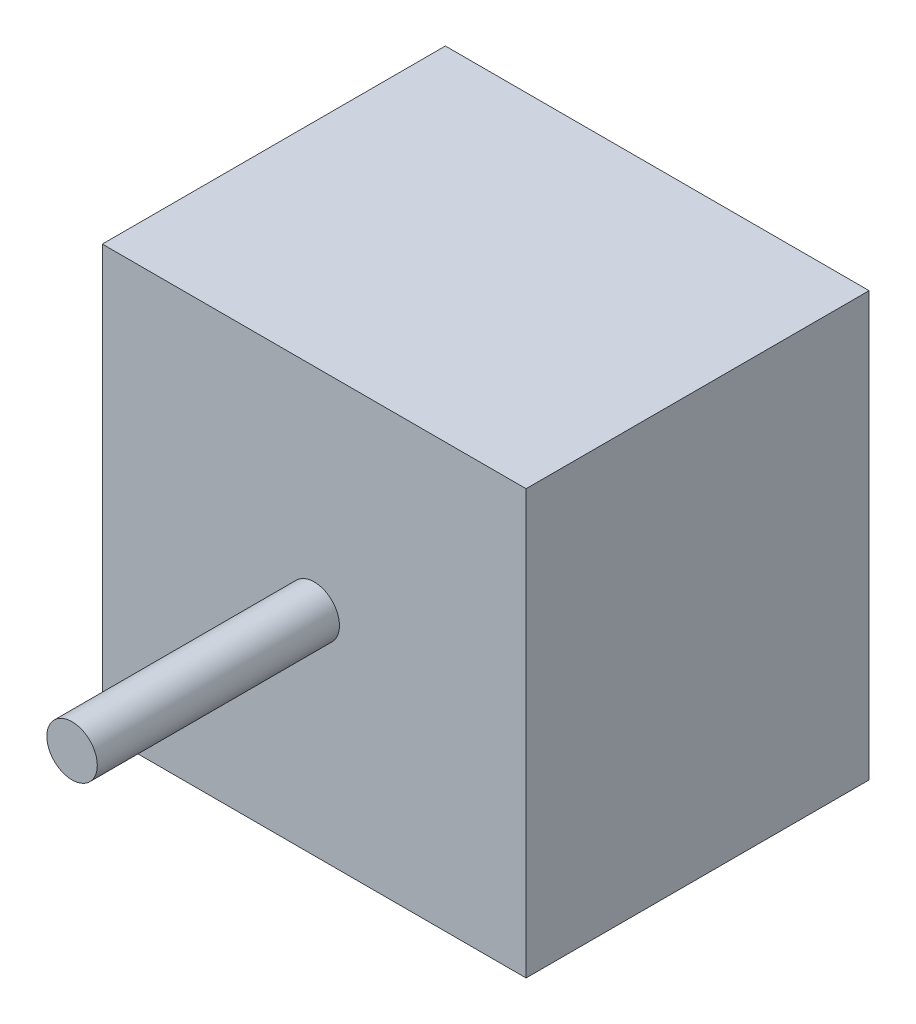
ISO-10303-21;
HEADER;
FILE_DESCRIPTION(('STEP AP214'),'2;1');
FILE_NAME('part.step','',(''),(''),'','','');
FILE_SCHEMA(('AUTOMOTIVE_DESIGN { 1 0 10303 214 1 1 1 1 }'));
ENDSEC;
DATA;
#1=APPLICATION_CONTEXT('core data for automotive mechanical design processes');
#2=APPLICATION_PROTOCOL_DEFINITION('international standard','automotive_design',2000,#1);
#3=PRODUCT_CONTEXT('',#1,'mechanical');
#4=PRODUCT('Part','Part','',(#3));
#5=PRODUCT_RELATED_PRODUCT_CATEGORY('part','',(#4));
#6=PRODUCT_DEFINITION_FORMATION('','',#4);
#7=PRODUCT_DEFINITION_CONTEXT('part definition',#1,'design');
#8=PRODUCT_DEFINITION('design','',#6,#7);
#9=PRODUCT_DEFINITION_SHAPE('','',#8);
#10=(LENGTH_UNIT() NAMED_UNIT(*) SI_UNIT(.MILLI.,.METRE.));
#11=(NAMED_UNIT(*) PLANE_ANGLE_UNIT() SI_UNIT($,.RADIAN.));
#12=(NAMED_UNIT(*) SI_UNIT($,.STERADIAN.) SOLID_ANGLE_UNIT());
#13=UNCERTAINTY_MEASURE_WITH_UNIT(LENGTH_MEASURE(1.E-05),#10,'distance_accuracy_value','');
#14=(GEOMETRIC_REPRESENTATION_CONTEXT(3) GLOBAL_UNCERTAINTY_ASSIGNED_CONTEXT((#13)) GLOBAL_UNIT_ASSIGNED_CONTEXT((#10,
#11,#12)) REPRESENTATION_CONTEXT('',''));
#15=CARTESIAN_POINT('',(0.,0.,0.));
#16=DIRECTION('',(0.,0.,1.));
#17=DIRECTION('',(1.,0.,0.));
#18=AXIS2_PLACEMENT_3D('',#15,#16,#17);
#19=CARTESIAN_POINT('',(21.,21.,34.));
#20=DIRECTION('',(-1.,0.,0.));
#21=DIRECTION('',(0.,0.,1.));
#22=AXIS2_PLACEMENT_3D('',#19,#20,#21);
#23=PLANE('',#22);
#24=DIRECTION('',(0.,1.,0.));
#25=VECTOR('',#24,1.);
#26=CARTESIAN_POINT('',(21.,21.,0.));
#27=LINE('',#26,#25);
#28=CARTESIAN_POINT('',(21.,-21.,0.));
#29=VERTEX_POINT('',#28);
#30=CARTESIAN_POINT('',(21.,21.,0.));
#31=VERTEX_POINT('',#30);
#32=EDGE_CURVE('E98',#29,#31,#27,.T.);
#33=ORIENTED_EDGE('',*,*,#32,.T.);
#34=DIRECTION('',(0.,0.,-1.));
#35=VECTOR('',#34,1.);
#36=CARTESIAN_POINT('',(21.,21.,34.));
#37=LINE('',#36,#35);
#38=CARTESIAN_POINT('',(21.,21.,34.));
#39=VERTEX_POINT('',#38);
#40=EDGE_CURVE('E11',#39,#31,#37,.T.);
#41=ORIENTED_EDGE('',*,*,#40,.F.);
#42=DIRECTION('',(0.,1.,0.));
#43=VECTOR('',#42,1.);
#44=CARTESIAN_POINT('',(21.,21.,34.));
#45=LINE('',#44,#43);
#46=CARTESIAN_POINT('',(21.,-21.,34.));
#47=VERTEX_POINT('',#46);
#48=EDGE_CURVE('E86',#47,#39,#45,.T.);
#49=ORIENTED_EDGE('',*,*,#48,.F.);
#50=DIRECTION('',(0.,0.,-1.));
#51=VECTOR('',#50,1.);
#52=CARTESIAN_POINT('',(21.,-21.,34.));
#53=LINE('',#52,#51);
#54=EDGE_CURVE('E94',#47,#29,#53,.T.);
#55=ORIENTED_EDGE('',*,*,#54,.T.);
#56=EDGE_LOOP('',(#33,#41,#49,#55));
#57=FACE_BOUND('',#56,.T.);
#58=ADVANCED_FACE('F35',(#57),#23,.F.);
#59=CARTESIAN_POINT('',(-21.,21.,34.));
#60=DIRECTION('',(0.,-1.,0.));
#61=DIRECTION('',(0.,0.,-1.));
#62=AXIS2_PLACEMENT_3D('',#59,#60,#61);
#63=PLANE('',#62);
#64=DIRECTION('',(-1.,0.,0.));
#65=VECTOR('',#64,1.);
#66=CARTESIAN_POINT('',(-21.,21.,0.));
#67=LINE('',#66,#65);
#68=CARTESIAN_POINT('',(-21.,21.,0.));
#69=VERTEX_POINT('',#68);
#70=EDGE_CURVE('E90',#31,#69,#67,.T.);
#71=ORIENTED_EDGE('',*,*,#70,.T.);
#72=DIRECTION('',(0.,0.,-1.));
#73=VECTOR('',#72,1.);
#74=CARTESIAN_POINT('',(-21.,21.,34.));
#75=LINE('',#74,#73);
#76=CARTESIAN_POINT('',(-21.,21.,34.));
#77=VERTEX_POINT('',#76);
#78=EDGE_CURVE('E43',#77,#69,#75,.T.);
#79=ORIENTED_EDGE('',*,*,#78,.F.);
#80=DIRECTION('',(-1.,0.,0.));
#81=VECTOR('',#80,1.);
#82=CARTESIAN_POINT('',(-21.,21.,34.));
#83=LINE('',#82,#81);
#84=EDGE_CURVE('E81',#39,#77,#83,.T.);
#85=ORIENTED_EDGE('',*,*,#84,.F.);
#86=ORIENTED_EDGE('',*,*,#40,.T.);
#87=EDGE_LOOP('',(#71,#79,#85,#86));
#88=FACE_BOUND('',#87,.T.);
#89=ADVANCED_FACE('F89',(#88),#63,.F.);
#90=CARTESIAN_POINT('',(-21.,21.,34.));
#91=DIRECTION('',(1.,0.,0.));
#92=DIRECTION('',(0.,1.,0.));
#93=AXIS2_PLACEMENT_3D('',#90,#91,#92);
#94=PLANE('',#93);
#95=DIRECTION('',(0.,-1.,0.));
#96=VECTOR('',#95,1.);
#97=CARTESIAN_POINT('',(-21.,21.,0.));
#98=LINE('',#97,#96);
#99=CARTESIAN_POINT('',(-21.,-21.,0.));
#100=VERTEX_POINT('',#99);
#101=EDGE_CURVE('E68',#69,#100,#98,.T.);
#102=ORIENTED_EDGE('',*,*,#101,.T.);
#103=DIRECTION('',(0.,0.,-1.));
#104=VECTOR('',#103,1.);
#105=CARTESIAN_POINT('',(-21.,-21.,34.));
#106=LINE('',#105,#104);
#107=CARTESIAN_POINT('',(-21.,-21.,34.));
#108=VERTEX_POINT('',#107);
#109=EDGE_CURVE('E91',#108,#100,#106,.T.);
#110=ORIENTED_EDGE('',*,*,#109,.F.);
#111=DIRECTION('',(0.,-1.,0.));
#112=VECTOR('',#111,1.);
#113=CARTESIAN_POINT('',(-21.,21.,34.));
#114=LINE('',#113,#112);
#115=EDGE_CURVE('E84',#77,#108,#114,.T.);
#116=ORIENTED_EDGE('',*,*,#115,.F.);
#117=ORIENTED_EDGE('',*,*,#78,.T.);
#118=EDGE_LOOP('',(#102,#110,#116,#117));
#119=FACE_BOUND('',#118,.T.);
#120=ADVANCED_FACE('F92',(#119),#94,.F.);
#121=CARTESIAN_POINT('',(-21.,-21.,34.));
#122=DIRECTION('',(0.,1.,0.));
#123=DIRECTION('',(0.,0.,1.));
#124=AXIS2_PLACEMENT_3D('',#121,#122,#123);
#125=PLANE('',#124);
#126=DIRECTION('',(1.,0.,0.));
#127=VECTOR('',#126,1.);
#128=CARTESIAN_POINT('',(-21.,-21.,0.));
#129=LINE('',#128,#127);
#130=EDGE_CURVE('E74',#100,#29,#129,.T.);
#131=ORIENTED_EDGE('',*,*,#130,.T.);
#132=ORIENTED_EDGE('',*,*,#54,.F.);
#133=DIRECTION('',(1.,0.,0.));
#134=VECTOR('',#133,1.);
#135=CARTESIAN_POINT('',(-21.,-21.,34.));
#136=LINE('',#135,#134);
#137=EDGE_CURVE('E51',#108,#47,#136,.T.);
#138=ORIENTED_EDGE('',*,*,#137,.F.);
#139=ORIENTED_EDGE('',*,*,#109,.T.);
#140=EDGE_LOOP('',(#131,#132,#138,#139));
#141=FACE_BOUND('',#140,.T.);
#142=ADVANCED_FACE('F106',(#141),#125,.F.);
#143=CARTESIAN_POINT('',(0.,0.,34.));
#144=DIRECTION('',(0.,0.,1.));
#145=DIRECTION('',(1.,0.,0.));
#146=AXIS2_PLACEMENT_3D('',#143,#144,#145);
#147=PLANE('',#146);
#148=CARTESIAN_POINT('',(0.,0.,34.));
#149=DIRECTION('',(0.,0.,1.));
#150=DIRECTION('',(1.,0.,0.));
#151=AXIS2_PLACEMENT_3D('',#148,#149,#150);
#152=CIRCLE('',#151,2.5);
#153=CARTESIAN_POINT('',(2.5,0.,34.));
#154=VERTEX_POINT('',#153);
#155=EDGE_CURVE('E112',#154,#154,#152,.T.);
#156=ORIENTED_EDGE('',*,*,#155,.F.);
#157=EDGE_LOOP('',(#156));
#158=FACE_BOUND('',#157,.T.);
#159=ORIENTED_EDGE('',*,*,#48,.T.);
#160=ORIENTED_EDGE('',*,*,#84,.T.);
#161=ORIENTED_EDGE('',*,*,#115,.T.);
#162=ORIENTED_EDGE('',*,*,#137,.T.);
#163=EDGE_LOOP('',(#159,#160,#161,#162));
#164=FACE_BOUND('',#163,.T.);
#165=ADVANCED_FACE('F82',(#158,#164),#147,.T.);
#166=CARTESIAN_POINT('',(0.,0.,0.));
#167=DIRECTION('',(0.,0.,1.));
#168=DIRECTION('',(1.,0.,0.));
#169=AXIS2_PLACEMENT_3D('',#166,#167,#168);
#170=PLANE('',#169);
#171=ORIENTED_EDGE('',*,*,#32,.F.);
#172=ORIENTED_EDGE('',*,*,#130,.F.);
#173=ORIENTED_EDGE('',*,*,#101,.F.);
#174=ORIENTED_EDGE('',*,*,#70,.F.);
#175=EDGE_LOOP('',(#171,#172,#173,#174));
#176=FACE_BOUND('',#175,.T.);
#177=ADVANCED_FACE('F109',(#176),#170,.F.);
#178=CARTESIAN_POINT('',(0.,0.,58.));
#179=DIRECTION('',(0.,0.,-1.));
#180=DIRECTION('',(-1.,0.,0.));
#181=AXIS2_PLACEMENT_3D('',#178,#179,#180);
#182=CYLINDRICAL_SURFACE('',#181,2.5);
#183=CARTESIAN_POINT('',(0.,0.,58.));
#184=DIRECTION('',(0.,0.,1.));
#185=DIRECTION('',(1.,0.,0.));
#186=AXIS2_PLACEMENT_3D('',#183,#184,#185);
#187=CIRCLE('',#186,2.5);
#188=CARTESIAN_POINT('',(2.5,0.,58.));
#189=VERTEX_POINT('',#188);
#190=EDGE_CURVE('E101',#189,#189,#187,.T.);
#191=ORIENTED_EDGE('',*,*,#190,.F.);
#192=EDGE_LOOP('',(#191));
#193=FACE_BOUND('',#192,.T.);
#194=ORIENTED_EDGE('',*,*,#155,.T.);
#195=EDGE_LOOP('',(#194));
#196=FACE_BOUND('',#195,.T.);
#197=ADVANCED_FACE('F120',(#193,#196),#182,.T.);
#198=CARTESIAN_POINT('',(0.,0.,58.));
#199=DIRECTION('',(0.,0.,1.));
#200=DIRECTION('',(1.,0.,0.));
#201=AXIS2_PLACEMENT_3D('',#198,#199,#200);
#202=PLANE('',#201);
#203=ORIENTED_EDGE('',*,*,#190,.T.);
#204=EDGE_LOOP('',(#203));
#205=FACE_BOUND('',#204,.T.);
#206=ADVANCED_FACE('F118',(#205),#202,.T.);
#207=CLOSED_SHELL('',(#58,#89,#120,#142,#165,#177,#197,#206));
#208=MANIFOLD_SOLID_BREP('B2',#207);
#209=ADVANCED_BREP_SHAPE_REPRESENTATION('',(#18,#208),#14);
#210=SHAPE_DEFINITION_REPRESENTATION(#9,#209);
ENDSEC;
END-ISO-10303-21;
